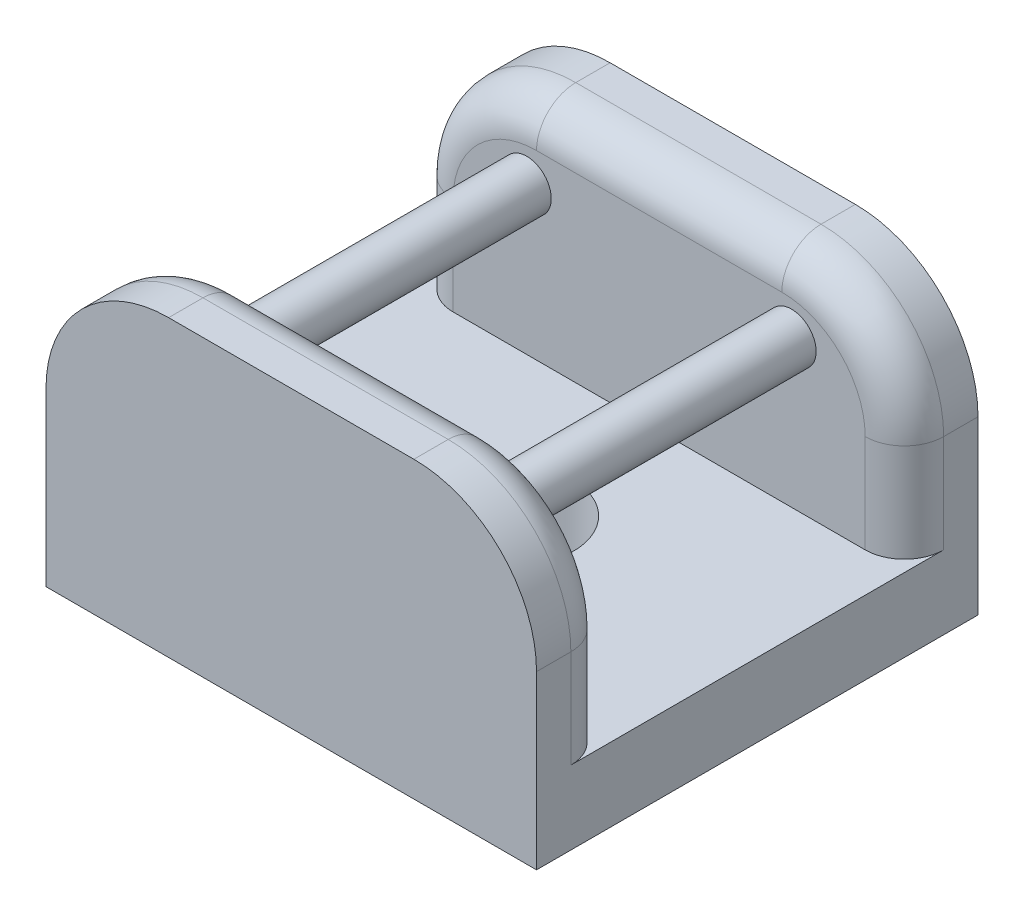
ISO-10303-21;
HEADER;
FILE_DESCRIPTION(('STEP AP214'),'2;1');
FILE_NAME('part.step','',(''),(''),'','','');
FILE_SCHEMA(('AUTOMOTIVE_DESIGN { 1 0 10303 214 1 1 1 1 }'));
ENDSEC;
DATA;
#1=APPLICATION_CONTEXT('core data for automotive mechanical design processes');
#2=APPLICATION_PROTOCOL_DEFINITION('international standard','automotive_design',2000,#1);
#3=PRODUCT_CONTEXT('',#1,'mechanical');
#4=PRODUCT('Part','Part','',(#3));
#5=PRODUCT_RELATED_PRODUCT_CATEGORY('part','',(#4));
#6=PRODUCT_DEFINITION_FORMATION('','',#4);
#7=PRODUCT_DEFINITION_CONTEXT('part definition',#1,'design');
#8=PRODUCT_DEFINITION('design','',#6,#7);
#9=PRODUCT_DEFINITION_SHAPE('','',#8);
#10=(LENGTH_UNIT() NAMED_UNIT(*) SI_UNIT(.MILLI.,.METRE.));
#11=(NAMED_UNIT(*) PLANE_ANGLE_UNIT() SI_UNIT($,.RADIAN.));
#12=(NAMED_UNIT(*) SI_UNIT($,.STERADIAN.) SOLID_ANGLE_UNIT());
#13=UNCERTAINTY_MEASURE_WITH_UNIT(LENGTH_MEASURE(1.E-05),#10,'distance_accuracy_value','');
#14=(GEOMETRIC_REPRESENTATION_CONTEXT(3) GLOBAL_UNCERTAINTY_ASSIGNED_CONTEXT((#13)) GLOBAL_UNIT_ASSIGNED_CONTEXT((#10,
#11,#12)) REPRESENTATION_CONTEXT('',''));
#15=CARTESIAN_POINT('',(0.,0.,0.));
#16=DIRECTION('',(0.,0.,1.));
#17=DIRECTION('',(1.,0.,0.));
#18=AXIS2_PLACEMENT_3D('',#15,#16,#17);
#19=CARTESIAN_POINT('',(100.,60.,-90.));
#20=DIRECTION('',(0.,0.,1.));
#21=DIRECTION('',(0.,-1.,0.));
#22=AXIS2_PLACEMENT_3D('',#19,#20,#21);
#23=PLANE('',#22);
#24=CARTESIAN_POINT('',(75.,35.,-90.));
#25=DIRECTION('',(0.,0.,-1.));
#26=DIRECTION('',(0.,1.,0.));
#27=AXIS2_PLACEMENT_3D('',#24,#25,#26);
#28=CIRCLE('',#27,25.);
#29=CARTESIAN_POINT('',(75.,60.,-90.));
#30=VERTEX_POINT('',#29);
#31=CARTESIAN_POINT('',(100.,35.,-90.));
#32=VERTEX_POINT('',#31);
#33=EDGE_CURVE('E189',#30,#32,#28,.T.);
#34=ORIENTED_EDGE('',*,*,#33,.T.);
#35=DIRECTION('',(0.,1.,0.));
#36=VECTOR('',#35,1.);
#37=CARTESIAN_POINT('',(100.,60.,-90.));
#38=LINE('',#37,#36);
#39=CARTESIAN_POINT('',(100.,0.,-90.));
#40=VERTEX_POINT('',#39);
#41=EDGE_CURVE('E320',#40,#32,#38,.T.);
#42=ORIENTED_EDGE('',*,*,#41,.F.);
#43=DIRECTION('',(-1.,0.,0.));
#44=VECTOR('',#43,1.);
#45=CARTESIAN_POINT('',(100.,0.,-90.));
#46=LINE('',#45,#44);
#47=CARTESIAN_POINT('',(0.,0.,-90.));
#48=VERTEX_POINT('',#47);
#49=EDGE_CURVE('E210',#40,#48,#46,.T.);
#50=ORIENTED_EDGE('',*,*,#49,.T.);
#51=DIRECTION('',(0.,1.,0.));
#52=VECTOR('',#51,1.);
#53=CARTESIAN_POINT('',(0.,60.,-90.));
#54=LINE('',#53,#52);
#55=CARTESIAN_POINT('',(0.,35.,-90.));
#56=VERTEX_POINT('',#55);
#57=EDGE_CURVE('E349',#48,#56,#54,.T.);
#58=ORIENTED_EDGE('',*,*,#57,.T.);
#59=CARTESIAN_POINT('',(25.,35.,-90.));
#60=DIRECTION('',(0.,0.,-1.));
#61=DIRECTION('',(0.,1.,0.));
#62=AXIS2_PLACEMENT_3D('',#59,#60,#61);
#63=CIRCLE('',#62,25.);
#64=CARTESIAN_POINT('',(25.,60.,-90.));
#65=VERTEX_POINT('',#64);
#66=EDGE_CURVE('E293',#65,#56,#63,.F.);
#67=ORIENTED_EDGE('',*,*,#66,.F.);
#68=DIRECTION('',(-1.,0.,0.));
#69=VECTOR('',#68,1.);
#70=CARTESIAN_POINT('',(100.,60.,-90.));
#71=LINE('',#70,#69);
#72=EDGE_CURVE('E207',#30,#65,#71,.T.);
#73=ORIENTED_EDGE('',*,*,#72,.F.);
#74=EDGE_LOOP('',(#34,#42,#50,#58,#67,#73));
#75=FACE_BOUND('',#74,.T.);
#76=ADVANCED_FACE('F41',(#75),#23,.F.);
#77=CARTESIAN_POINT('',(100.,15.,-75.));
#78=DIRECTION('',(0.,0.,-1.));
#79=DIRECTION('',(-1.,0.,0.));
#80=AXIS2_PLACEMENT_3D('',#77,#78,#79);
#81=PLANE('',#80);
#82=CARTESIAN_POINT('',(25.,35.,-75.));
#83=DIRECTION('',(0.,0.,-1.));
#84=DIRECTION('',(-1.,0.,0.));
#85=AXIS2_PLACEMENT_3D('',#82,#83,#84);
#86=CIRCLE('',#85,17.);
#87=CARTESIAN_POINT('',(25.,52.,-75.));
#88=VERTEX_POINT('',#87);
#89=CARTESIAN_POINT('',(7.99999999999999,35.,-75.));
#90=VERTEX_POINT('',#89);
#91=EDGE_CURVE('E265',#88,#90,#86,.F.);
#92=ORIENTED_EDGE('',*,*,#91,.T.);
#93=DIRECTION('',(0.,-1.,0.));
#94=VECTOR('',#93,1.);
#95=CARTESIAN_POINT('',(8.00000000000001,15.,-75.));
#96=LINE('',#95,#94);
#97=CARTESIAN_POINT('',(8.00000000000001,15.,-75.));
#98=VERTEX_POINT('',#97);
#99=EDGE_CURVE('E267',#90,#98,#96,.T.);
#100=ORIENTED_EDGE('',*,*,#99,.T.);
#101=DIRECTION('',(-1.,0.,0.));
#102=VECTOR('',#101,1.);
#103=CARTESIAN_POINT('',(100.,15.,-75.));
#104=LINE('',#103,#102);
#105=CARTESIAN_POINT('',(92.,15.,-75.));
#106=VERTEX_POINT('',#105);
#107=EDGE_CURVE('E199',#106,#98,#104,.T.);
#108=ORIENTED_EDGE('',*,*,#107,.F.);
#109=DIRECTION('',(0.,-1.,0.));
#110=VECTOR('',#109,1.);
#111=CARTESIAN_POINT('',(92.,15.,-75.));
#112=LINE('',#111,#110);
#113=CARTESIAN_POINT('',(92.,35.,-75.));
#114=VERTEX_POINT('',#113);
#115=EDGE_CURVE('E261',#106,#114,#112,.F.);
#116=ORIENTED_EDGE('',*,*,#115,.T.);
#117=CARTESIAN_POINT('',(75.,35.,-75.));
#118=DIRECTION('',(0.,0.,-1.));
#119=DIRECTION('',(-1.,0.,0.));
#120=AXIS2_PLACEMENT_3D('',#117,#118,#119);
#121=CIRCLE('',#120,17.);
#122=CARTESIAN_POINT('',(75.,52.,-75.));
#123=VERTEX_POINT('',#122);
#124=EDGE_CURVE('E259',#114,#123,#121,.F.);
#125=ORIENTED_EDGE('',*,*,#124,.T.);
#126=DIRECTION('',(-1.,0.,0.));
#127=VECTOR('',#126,1.);
#128=CARTESIAN_POINT('',(100.,52.,-75.));
#129=LINE('',#128,#127);
#130=EDGE_CURVE('E263',#123,#88,#129,.T.);
#131=ORIENTED_EDGE('',*,*,#130,.T.);
#132=EDGE_LOOP('',(#92,#100,#108,#116,#125,#131));
#133=FACE_BOUND('',#132,.T.);
#134=CARTESIAN_POINT('',(23.,45.,-75.));
#135=DIRECTION('',(0.,0.,-1.));
#136=DIRECTION('',(-1.,0.,0.));
#137=AXIS2_PLACEMENT_3D('',#134,#135,#136);
#138=CIRCLE('',#137,5.);
#139=CARTESIAN_POINT('',(23.,40.,-75.));
#140=VERTEX_POINT('',#139);
#141=EDGE_CURVE('E222',#140,#140,#138,.F.);
#142=ORIENTED_EDGE('',*,*,#141,.F.);
#143=EDGE_LOOP('',(#142));
#144=FACE_BOUND('',#143,.T.);
#145=CARTESIAN_POINT('',(77.,45.,-75.));
#146=DIRECTION('',(0.,0.,-1.));
#147=DIRECTION('',(-1.,0.,0.));
#148=AXIS2_PLACEMENT_3D('',#145,#146,#147);
#149=CIRCLE('',#148,5.00000000000001);
#150=CARTESIAN_POINT('',(77.,40.,-75.));
#151=VERTEX_POINT('',#150);
#152=EDGE_CURVE('E216',#151,#151,#149,.F.);
#153=ORIENTED_EDGE('',*,*,#152,.F.);
#154=EDGE_LOOP('',(#153));
#155=FACE_BOUND('',#154,.T.);
#156=ADVANCED_FACE('F371',(#133,#144,#155),#81,.F.);
#157=CARTESIAN_POINT('',(100.,60.,-15.));
#158=DIRECTION('',(0.,0.,1.));
#159=DIRECTION('',(0.,-1.,0.));
#160=AXIS2_PLACEMENT_3D('',#157,#158,#159);
#161=PLANE('',#160);
#162=CARTESIAN_POINT('',(75.,35.0000000000001,-15.));
#163=DIRECTION('',(0.,0.,1.));
#164=DIRECTION('',(0.,-1.,0.));
#165=AXIS2_PLACEMENT_3D('',#162,#163,#164);
#166=CIRCLE('',#165,17.);
#167=CARTESIAN_POINT('',(75.,52.0000000000001,-15.));
#168=VERTEX_POINT('',#167);
#169=CARTESIAN_POINT('',(92.,35.0000000000001,-15.));
#170=VERTEX_POINT('',#169);
#171=EDGE_CURVE('E240',#168,#170,#166,.F.);
#172=ORIENTED_EDGE('',*,*,#171,.T.);
#173=DIRECTION('',(0.,1.,0.));
#174=VECTOR('',#173,1.);
#175=CARTESIAN_POINT('',(92.,60.,-15.));
#176=LINE('',#175,#174);
#177=CARTESIAN_POINT('',(92.,15.,-15.));
#178=VERTEX_POINT('',#177);
#179=EDGE_CURVE('E248',#170,#178,#176,.F.);
#180=ORIENTED_EDGE('',*,*,#179,.T.);
#181=DIRECTION('',(-1.,0.,0.));
#182=VECTOR('',#181,1.);
#183=CARTESIAN_POINT('',(100.,15.,-15.));
#184=LINE('',#183,#182);
#185=CARTESIAN_POINT('',(8.00000000000001,15.,-15.));
#186=VERTEX_POINT('',#185);
#187=EDGE_CURVE('E195',#178,#186,#184,.T.);
#188=ORIENTED_EDGE('',*,*,#187,.T.);
#189=DIRECTION('',(0.,1.,0.));
#190=VECTOR('',#189,1.);
#191=CARTESIAN_POINT('',(8.00000000000001,35.,-15.));
#192=LINE('',#191,#190);
#193=CARTESIAN_POINT('',(7.99999999999999,35.0000000000001,-15.));
#194=VERTEX_POINT('',#193);
#195=EDGE_CURVE('E246',#186,#194,#192,.T.);
#196=ORIENTED_EDGE('',*,*,#195,.T.);
#197=CARTESIAN_POINT('',(25.,35.0000000000001,-15.));
#198=DIRECTION('',(0.,0.,1.));
#199=DIRECTION('',(0.,-1.,0.));
#200=AXIS2_PLACEMENT_3D('',#197,#198,#199);
#201=CIRCLE('',#200,17.);
#202=CARTESIAN_POINT('',(25.,52.,-15.));
#203=VERTEX_POINT('',#202);
#204=EDGE_CURVE('E244',#194,#203,#201,.F.);
#205=ORIENTED_EDGE('',*,*,#204,.T.);
#206=DIRECTION('',(-1.,0.,0.));
#207=VECTOR('',#206,1.);
#208=CARTESIAN_POINT('',(100.,52.,-15.));
#209=LINE('',#208,#207);
#210=EDGE_CURVE('E242',#203,#168,#209,.F.);
#211=ORIENTED_EDGE('',*,*,#210,.T.);
#212=EDGE_LOOP('',(#172,#180,#188,#196,#205,#211));
#213=FACE_BOUND('',#212,.T.);
#214=CARTESIAN_POINT('',(23.,45.,-15.));
#215=DIRECTION('',(0.,0.,1.));
#216=DIRECTION('',(0.,-1.,0.));
#217=AXIS2_PLACEMENT_3D('',#214,#215,#216);
#218=CIRCLE('',#217,5.);
#219=CARTESIAN_POINT('',(23.,40.,-15.));
#220=VERTEX_POINT('',#219);
#221=EDGE_CURVE('E219',#220,#220,#218,.F.);
#222=ORIENTED_EDGE('',*,*,#221,.F.);
#223=EDGE_LOOP('',(#222));
#224=FACE_BOUND('',#223,.T.);
#225=CARTESIAN_POINT('',(77.,45.,-15.));
#226=DIRECTION('',(0.,0.,1.));
#227=DIRECTION('',(0.,-1.,0.));
#228=AXIS2_PLACEMENT_3D('',#225,#226,#227);
#229=CIRCLE('',#228,5.00000000000001);
#230=CARTESIAN_POINT('',(77.,40.,-15.));
#231=VERTEX_POINT('',#230);
#232=EDGE_CURVE('E213',#231,#231,#229,.F.);
#233=ORIENTED_EDGE('',*,*,#232,.F.);
#234=EDGE_LOOP('',(#233));
#235=FACE_BOUND('',#234,.T.);
#236=ADVANCED_FACE('F405',(#213,#224,#235),#161,.F.);
#237=CARTESIAN_POINT('',(100.,0.,0.));
#238=DIRECTION('',(0.,0.,-1.));
#239=DIRECTION('',(-1.,0.,0.));
#240=AXIS2_PLACEMENT_3D('',#237,#238,#239);
#241=PLANE('',#240);
#242=CARTESIAN_POINT('',(75.,35.0000000000001,0.));
#243=DIRECTION('',(0.,0.,-1.));
#244=DIRECTION('',(0.,1.,0.));
#245=AXIS2_PLACEMENT_3D('',#242,#243,#244);
#246=CIRCLE('',#245,25.);
#247=CARTESIAN_POINT('',(75.,60.,0.));
#248=VERTEX_POINT('',#247);
#249=CARTESIAN_POINT('',(100.,35.0000000000001,0.));
#250=VERTEX_POINT('',#249);
#251=EDGE_CURVE('E171',#248,#250,#246,.T.);
#252=ORIENTED_EDGE('',*,*,#251,.F.);
#253=DIRECTION('',(-1.,0.,0.));
#254=VECTOR('',#253,1.);
#255=CARTESIAN_POINT('',(100.,60.,0.));
#256=LINE('',#255,#254);
#257=CARTESIAN_POINT('',(25.,60.,0.));
#258=VERTEX_POINT('',#257);
#259=EDGE_CURVE('E186',#248,#258,#256,.T.);
#260=ORIENTED_EDGE('',*,*,#259,.T.);
#261=CARTESIAN_POINT('',(25.,35.0000000000001,0.));
#262=DIRECTION('',(0.,0.,-1.));
#263=DIRECTION('',(0.,1.,0.));
#264=AXIS2_PLACEMENT_3D('',#261,#262,#263);
#265=CIRCLE('',#264,25.);
#266=CARTESIAN_POINT('',(0.,35.0000000000001,0.));
#267=VERTEX_POINT('',#266);
#268=EDGE_CURVE('E334',#258,#267,#265,.F.);
#269=ORIENTED_EDGE('',*,*,#268,.T.);
#270=DIRECTION('',(0.,-1.,0.));
#271=VECTOR('',#270,1.);
#272=CARTESIAN_POINT('',(0.,0.,0.));
#273=LINE('',#272,#271);
#274=CARTESIAN_POINT('',(0.,0.,0.));
#275=VERTEX_POINT('',#274);
#276=EDGE_CURVE('E343',#267,#275,#273,.T.);
#277=ORIENTED_EDGE('',*,*,#276,.T.);
#278=DIRECTION('',(-1.,0.,0.));
#279=VECTOR('',#278,1.);
#280=CARTESIAN_POINT('',(100.,0.,0.));
#281=LINE('',#280,#279);
#282=CARTESIAN_POINT('',(100.,0.,0.));
#283=VERTEX_POINT('',#282);
#284=EDGE_CURVE('E196',#283,#275,#281,.T.);
#285=ORIENTED_EDGE('',*,*,#284,.F.);
#286=DIRECTION('',(0.,-1.,0.));
#287=VECTOR('',#286,1.);
#288=CARTESIAN_POINT('',(100.,0.,0.));
#289=LINE('',#288,#287);
#290=EDGE_CURVE('E188',#250,#283,#289,.T.);
#291=ORIENTED_EDGE('',*,*,#290,.F.);
#292=EDGE_LOOP('',(#252,#260,#269,#277,#285,#291));
#293=FACE_BOUND('',#292,.T.);
#294=ADVANCED_FACE('F184',(#293),#241,.F.);
#295=CARTESIAN_POINT('',(100.,0.,0.));
#296=DIRECTION('',(-1.,0.,0.));
#297=DIRECTION('',(0.,0.,1.));
#298=AXIS2_PLACEMENT_3D('',#295,#296,#297);
#299=PLANE('',#298);
#300=DIRECTION('',(0.,0.,1.));
#301=VECTOR('',#300,1.);
#302=CARTESIAN_POINT('',(100.,15.,-15.));
#303=LINE('',#302,#301);
#304=CARTESIAN_POINT('',(100.,15.,-83.));
#305=VERTEX_POINT('',#304);
#306=CARTESIAN_POINT('',(100.,15.,-7.));
#307=VERTEX_POINT('',#306);
#308=EDGE_CURVE('E317',#305,#307,#303,.T.);
#309=ORIENTED_EDGE('',*,*,#308,.T.);
#310=DIRECTION('',(0.,1.,0.));
#311=VECTOR('',#310,1.);
#312=CARTESIAN_POINT('',(100.,0.,-7.));
#313=LINE('',#312,#311);
#314=CARTESIAN_POINT('',(100.,35.0000000000001,-7.));
#315=VERTEX_POINT('',#314);
#316=EDGE_CURVE('E237',#307,#315,#313,.T.);
#317=ORIENTED_EDGE('',*,*,#316,.T.);
#318=DIRECTION('',(0.,0.,-1.));
#319=VECTOR('',#318,1.);
#320=CARTESIAN_POINT('',(100.,35.0000000000001,0.));
#321=LINE('',#320,#319);
#322=EDGE_CURVE('E178',#250,#315,#321,.T.);
#323=ORIENTED_EDGE('',*,*,#322,.F.);
#324=ORIENTED_EDGE('',*,*,#290,.T.);
#325=DIRECTION('',(0.,0.,-1.));
#326=VECTOR('',#325,1.);
#327=CARTESIAN_POINT('',(100.,0.,-90.));
#328=LINE('',#327,#326);
#329=EDGE_CURVE('E341',#283,#40,#328,.T.);
#330=ORIENTED_EDGE('',*,*,#329,.T.);
#331=ORIENTED_EDGE('',*,*,#41,.T.);
#332=DIRECTION('',(0.,0.,-1.));
#333=VECTOR('',#332,1.);
#334=CARTESIAN_POINT('',(100.,35.0000000000001,0.));
#335=LINE('',#334,#333);
#336=CARTESIAN_POINT('',(100.,35.,-82.9999999999999));
#337=VERTEX_POINT('',#336);
#338=EDGE_CURVE('E232',#337,#32,#335,.T.);
#339=ORIENTED_EDGE('',*,*,#338,.F.);
#340=DIRECTION('',(0.,-1.,0.));
#341=VECTOR('',#340,1.);
#342=CARTESIAN_POINT('',(100.,0.,-83.));
#343=LINE('',#342,#341);
#344=EDGE_CURVE('E234',#337,#305,#343,.T.);
#345=ORIENTED_EDGE('',*,*,#344,.T.);
#346=EDGE_LOOP('',(#309,#317,#323,#324,#330,#331,#339,#345));
#347=FACE_BOUND('',#346,.T.);
#348=ADVANCED_FACE('F316',(#347),#299,.F.);
#349=CARTESIAN_POINT('',(100.,0.,-90.));
#350=DIRECTION('',(0.,1.,0.));
#351=DIRECTION('',(0.,0.,1.));
#352=AXIS2_PLACEMENT_3D('',#349,#350,#351);
#353=PLANE('',#352);
#354=CARTESIAN_POINT('',(50.,0.,-45.));
#355=DIRECTION('',(0.,-1.,0.));
#356=DIRECTION('',(0.,0.,-1.));
#357=AXIS2_PLACEMENT_3D('',#354,#355,#356);
#358=CIRCLE('',#357,12.5);
#359=CARTESIAN_POINT('',(50.,0.,-57.5));
#360=VERTEX_POINT('',#359);
#361=EDGE_CURVE('E230',#360,#360,#358,.T.);
#362=ORIENTED_EDGE('',*,*,#361,.F.);
#363=EDGE_LOOP('',(#362));
#364=FACE_BOUND('',#363,.T.);
#365=DIRECTION('',(0.,0.,-1.));
#366=VECTOR('',#365,1.);
#367=CARTESIAN_POINT('',(0.,0.,-90.));
#368=LINE('',#367,#366);
#369=EDGE_CURVE('E229',#275,#48,#368,.T.);
#370=ORIENTED_EDGE('',*,*,#369,.T.);
#371=ORIENTED_EDGE('',*,*,#49,.F.);
#372=ORIENTED_EDGE('',*,*,#329,.F.);
#373=ORIENTED_EDGE('',*,*,#284,.T.);
#374=EDGE_LOOP('',(#370,#371,#372,#373));
#375=FACE_BOUND('',#374,.T.);
#376=ADVANCED_FACE('F358',(#364,#375),#353,.F.);
#377=CARTESIAN_POINT('',(100.,60.,-75.));
#378=DIRECTION('',(0.,-1.,0.));
#379=DIRECTION('',(0.,0.,-1.));
#380=AXIS2_PLACEMENT_3D('',#377,#378,#379);
#381=PLANE('',#380);
#382=DIRECTION('',(0.,0.,-1.));
#383=VECTOR('',#382,1.);
#384=CARTESIAN_POINT('',(25.,60.,0.));
#385=LINE('',#384,#383);
#386=CARTESIAN_POINT('',(25.,60.,-82.9999999999999));
#387=VERTEX_POINT('',#386);
#388=EDGE_CURVE('E336',#387,#65,#385,.T.);
#389=ORIENTED_EDGE('',*,*,#388,.F.);
#390=DIRECTION('',(-1.,0.,0.));
#391=VECTOR('',#390,1.);
#392=CARTESIAN_POINT('',(100.,60.,-83.));
#393=LINE('',#392,#391);
#394=CARTESIAN_POINT('',(75.,60.,-82.9999999999999));
#395=VERTEX_POINT('',#394);
#396=EDGE_CURVE('E58',#387,#395,#393,.F.);
#397=ORIENTED_EDGE('',*,*,#396,.T.);
#398=DIRECTION('',(0.,0.,-1.));
#399=VECTOR('',#398,1.);
#400=CARTESIAN_POINT('',(75.,60.,0.));
#401=LINE('',#400,#399);
#402=EDGE_CURVE('E179',#395,#30,#401,.T.);
#403=ORIENTED_EDGE('',*,*,#402,.T.);
#404=ORIENTED_EDGE('',*,*,#72,.T.);
#405=EDGE_LOOP('',(#389,#397,#403,#404));
#406=FACE_BOUND('',#405,.T.);
#407=ADVANCED_FACE('F362',(#406),#381,.F.);
#408=CARTESIAN_POINT('',(100.,15.,-15.));
#409=DIRECTION('',(0.,-1.,0.));
#410=DIRECTION('',(0.,0.,-1.));
#411=AXIS2_PLACEMENT_3D('',#408,#409,#410);
#412=PLANE('',#411);
#413=CARTESIAN_POINT('',(50.,15.,-45.));
#414=DIRECTION('',(0.,-1.,0.));
#415=DIRECTION('',(0.,0.,-1.));
#416=AXIS2_PLACEMENT_3D('',#413,#414,#415);
#417=CIRCLE('',#416,12.5);
#418=CARTESIAN_POINT('',(50.,15.,-57.5));
#419=VERTEX_POINT('',#418);
#420=EDGE_CURVE('E226',#419,#419,#417,.T.);
#421=ORIENTED_EDGE('',*,*,#420,.T.);
#422=EDGE_LOOP('',(#421));
#423=FACE_BOUND('',#422,.T.);
#424=DIRECTION('',(0.,0.,1.));
#425=VECTOR('',#424,1.);
#426=CARTESIAN_POINT('',(0.,15.,-15.));
#427=LINE('',#426,#425);
#428=CARTESIAN_POINT('',(0.,15.,-83.));
#429=VERTEX_POINT('',#428);
#430=CARTESIAN_POINT('',(0.,15.,-7.));
#431=VERTEX_POINT('',#430);
#432=EDGE_CURVE('E352',#429,#431,#427,.T.);
#433=ORIENTED_EDGE('',*,*,#432,.T.);
#434=CARTESIAN_POINT('',(8.00000000000001,15.,-7.));
#435=DIRECTION('',(0.,-1.,0.));
#436=DIRECTION('',(0.,0.,-1.));
#437=AXIS2_PLACEMENT_3D('',#434,#435,#436);
#438=CIRCLE('',#437,8.);
#439=EDGE_CURVE('E278',#431,#186,#438,.T.);
#440=ORIENTED_EDGE('',*,*,#439,.T.);
#441=ORIENTED_EDGE('',*,*,#187,.F.);
#442=CARTESIAN_POINT('',(92.,15.,-7.));
#443=DIRECTION('',(0.,-1.,0.));
#444=DIRECTION('',(0.,0.,-1.));
#445=AXIS2_PLACEMENT_3D('',#442,#443,#444);
#446=CIRCLE('',#445,8.);
#447=EDGE_CURVE('E275',#178,#307,#446,.T.);
#448=ORIENTED_EDGE('',*,*,#447,.T.);
#449=ORIENTED_EDGE('',*,*,#308,.F.);
#450=CARTESIAN_POINT('',(92.,15.,-83.));
#451=DIRECTION('',(0.,-1.,0.));
#452=DIRECTION('',(0.,0.,-1.));
#453=AXIS2_PLACEMENT_3D('',#450,#451,#452);
#454=CIRCLE('',#453,8.);
#455=EDGE_CURVE('E11',#305,#106,#454,.T.);
#456=ORIENTED_EDGE('',*,*,#455,.T.);
#457=ORIENTED_EDGE('',*,*,#107,.T.);
#458=CARTESIAN_POINT('',(8.00000000000001,15.,-83.));
#459=DIRECTION('',(0.,-1.,0.));
#460=DIRECTION('',(0.,0.,-1.));
#461=AXIS2_PLACEMENT_3D('',#458,#459,#460);
#462=CIRCLE('',#461,8.);
#463=EDGE_CURVE('E50',#98,#429,#462,.T.);
#464=ORIENTED_EDGE('',*,*,#463,.T.);
#465=EDGE_LOOP('',(#433,#440,#441,#448,#449,#456,#457,#464));
#466=FACE_BOUND('',#465,.T.);
#467=ADVANCED_FACE('F375',(#423,#466),#412,.F.);
#468=CARTESIAN_POINT('',(100.,60.,0.));
#469=DIRECTION('',(0.,-1.,0.));
#470=DIRECTION('',(0.,0.,-1.));
#471=AXIS2_PLACEMENT_3D('',#468,#469,#470);
#472=PLANE('',#471);
#473=CARTESIAN_POINT('',(75.,60.,-7.));
#474=VERTEX_POINT('',#473);
#475=EDGE_CURVE('E167',#248,#474,#401,.T.);
#476=ORIENTED_EDGE('',*,*,#475,.T.);
#477=DIRECTION('',(-1.,0.,0.));
#478=VECTOR('',#477,1.);
#479=CARTESIAN_POINT('',(100.,60.,-6.99999999999999));
#480=LINE('',#479,#478);
#481=CARTESIAN_POINT('',(25.,60.,-6.99999999999999));
#482=VERTEX_POINT('',#481);
#483=EDGE_CURVE('E257',#474,#482,#480,.T.);
#484=ORIENTED_EDGE('',*,*,#483,.T.);
#485=EDGE_CURVE('E194',#258,#482,#385,.T.);
#486=ORIENTED_EDGE('',*,*,#485,.F.);
#487=ORIENTED_EDGE('',*,*,#259,.F.);
#488=EDGE_LOOP('',(#476,#484,#486,#487));
#489=FACE_BOUND('',#488,.T.);
#490=ADVANCED_FACE('F192',(#489),#472,.F.);
#491=CARTESIAN_POINT('',(0.,0.,0.));
#492=DIRECTION('',(-1.,0.,0.));
#493=DIRECTION('',(0.,0.,1.));
#494=AXIS2_PLACEMENT_3D('',#491,#492,#493);
#495=PLANE('',#494);
#496=DIRECTION('',(0.,0.,-1.));
#497=VECTOR('',#496,1.);
#498=CARTESIAN_POINT('',(0.,35.0000000000001,0.));
#499=LINE('',#498,#497);
#500=CARTESIAN_POINT('',(0.,35.0000000000001,-7.));
#501=VERTEX_POINT('',#500);
#502=EDGE_CURVE('E328',#267,#501,#499,.T.);
#503=ORIENTED_EDGE('',*,*,#502,.T.);
#504=DIRECTION('',(0.,1.,0.));
#505=VECTOR('',#504,1.);
#506=CARTESIAN_POINT('',(0.,15.,-7.));
#507=LINE('',#506,#505);
#508=EDGE_CURVE('E252',#501,#431,#507,.F.);
#509=ORIENTED_EDGE('',*,*,#508,.T.);
#510=ORIENTED_EDGE('',*,*,#432,.F.);
#511=DIRECTION('',(0.,-1.,0.));
#512=VECTOR('',#511,1.);
#513=CARTESIAN_POINT('',(0.,35.,-83.));
#514=LINE('',#513,#512);
#515=CARTESIAN_POINT('',(0.,35.,-82.9999999999999));
#516=VERTEX_POINT('',#515);
#517=EDGE_CURVE('E250',#429,#516,#514,.F.);
#518=ORIENTED_EDGE('',*,*,#517,.T.);
#519=DIRECTION('',(0.,0.,-1.));
#520=VECTOR('',#519,1.);
#521=CARTESIAN_POINT('',(0.,35.0000000000001,0.));
#522=LINE('',#521,#520);
#523=EDGE_CURVE('E225',#56,#516,#522,.F.);
#524=ORIENTED_EDGE('',*,*,#523,.F.);
#525=ORIENTED_EDGE('',*,*,#57,.F.);
#526=ORIENTED_EDGE('',*,*,#369,.F.);
#527=ORIENTED_EDGE('',*,*,#276,.F.);
#528=EDGE_LOOP('',(#503,#509,#510,#518,#524,#525,#526,#527));
#529=FACE_BOUND('',#528,.T.);
#530=ADVANCED_FACE('F360',(#529),#495,.T.);
#531=CARTESIAN_POINT('',(77.,45.,-89.1421356237309));
#532=DIRECTION('',(0.,0.,1.));
#533=DIRECTION('',(0.,-1.,0.));
#534=AXIS2_PLACEMENT_3D('',#531,#532,#533);
#535=CYLINDRICAL_SURFACE('',#534,5.00000000000001);
#536=CARTESIAN_POINT('',(77.,40.,-15.));
#537=CARTESIAN_POINT('',(77.,40.,-15.625));
#538=CARTESIAN_POINT('',(77.,40.,-16.25));
#539=CARTESIAN_POINT('',(77.,40.,-17.5));
#540=CARTESIAN_POINT('',(77.,40.,-18.125));
#541=CARTESIAN_POINT('',(77.,40.,-19.375));
#542=CARTESIAN_POINT('',(77.,40.,-20.));
#543=CARTESIAN_POINT('',(77.,40.,-21.25));
#544=CARTESIAN_POINT('',(77.,40.,-21.875));
#545=CARTESIAN_POINT('',(77.,40.,-23.125));
#546=CARTESIAN_POINT('',(77.,40.,-23.75));
#547=CARTESIAN_POINT('',(77.,40.,-25.));
#548=CARTESIAN_POINT('',(77.,40.,-25.625));
#549=CARTESIAN_POINT('',(77.,40.,-26.875));
#550=CARTESIAN_POINT('',(77.,40.,-27.5));
#551=CARTESIAN_POINT('',(77.,40.,-28.75));
#552=CARTESIAN_POINT('',(77.,40.,-29.375));
#553=CARTESIAN_POINT('',(77.,40.,-30.625));
#554=CARTESIAN_POINT('',(77.,40.,-31.25));
#555=CARTESIAN_POINT('',(77.,40.,-32.5));
#556=CARTESIAN_POINT('',(77.,40.,-33.125));
#557=CARTESIAN_POINT('',(77.,40.,-34.375));
#558=CARTESIAN_POINT('',(77.,40.,-35.));
#559=CARTESIAN_POINT('',(77.,40.,-36.25));
#560=CARTESIAN_POINT('',(77.,40.,-36.875));
#561=CARTESIAN_POINT('',(77.,40.,-38.125));
#562=CARTESIAN_POINT('',(77.,40.,-38.75));
#563=CARTESIAN_POINT('',(77.,40.,-40.));
#564=CARTESIAN_POINT('',(77.,40.,-40.625));
#565=CARTESIAN_POINT('',(77.,40.,-41.875));
#566=CARTESIAN_POINT('',(77.,40.,-42.5));
#567=CARTESIAN_POINT('',(77.,40.,-43.75));
#568=CARTESIAN_POINT('',(77.,40.,-44.375));
#569=CARTESIAN_POINT('',(77.,40.,-45.625));
#570=CARTESIAN_POINT('',(77.,40.,-46.25));
#571=CARTESIAN_POINT('',(77.,40.,-47.5));
#572=CARTESIAN_POINT('',(77.,40.,-48.125));
#573=CARTESIAN_POINT('',(77.,40.,-49.375));
#574=CARTESIAN_POINT('',(77.,40.,-50.));
#575=CARTESIAN_POINT('',(77.,40.,-51.25));
#576=CARTESIAN_POINT('',(77.,40.,-51.875));
#577=CARTESIAN_POINT('',(77.,40.,-53.125));
#578=CARTESIAN_POINT('',(77.,40.,-53.75));
#579=CARTESIAN_POINT('',(77.,40.,-55.));
#580=CARTESIAN_POINT('',(77.,40.,-55.625));
#581=CARTESIAN_POINT('',(77.,40.,-56.875));
#582=CARTESIAN_POINT('',(77.,40.,-57.5));
#583=CARTESIAN_POINT('',(77.,40.,-58.75));
#584=CARTESIAN_POINT('',(77.,40.,-59.375));
#585=CARTESIAN_POINT('',(77.,40.,-60.625));
#586=CARTESIAN_POINT('',(77.,40.,-61.25));
#587=CARTESIAN_POINT('',(77.,40.,-62.5));
#588=CARTESIAN_POINT('',(77.,40.,-63.125));
#589=CARTESIAN_POINT('',(77.,40.,-64.375));
#590=CARTESIAN_POINT('',(77.,40.,-65.));
#591=CARTESIAN_POINT('',(77.,40.,-66.25));
#592=CARTESIAN_POINT('',(77.,40.,-66.875));
#593=CARTESIAN_POINT('',(77.,40.,-68.125));
#594=CARTESIAN_POINT('',(77.,40.,-68.75));
#595=CARTESIAN_POINT('',(77.,40.,-70.));
#596=CARTESIAN_POINT('',(77.,40.,-70.625));
#597=CARTESIAN_POINT('',(77.,40.,-71.875));
#598=CARTESIAN_POINT('',(77.,40.,-72.5));
#599=CARTESIAN_POINT('',(77.,40.,-73.75));
#600=CARTESIAN_POINT('',(77.,40.,-74.375));
#601=CARTESIAN_POINT('',(77.,40.,-75.));
#602=B_SPLINE_CURVE_WITH_KNOTS('',3,(#536,#537,#538,#539,#540,#541,#542,#543,#544,#545,#546,
#547,#548,#549,#550,#551,#552,#553,#554,#555,#556,#557,#558,#559,#560,#561,#562,#563,#564,#565,
#566,#567,#568,#569,#570,#571,#572,#573,#574,#575,#576,#577,#578,#579,#580,#581,#582,#583,#584,
#585,#586,#587,#588,#589,#590,#591,#592,#593,#594,#595,#596,#597,#598,#599,#600,#601),
.UNSPECIFIED.,.F.,.F.,(4,2,2,2,2,2,2,2,2,2,2,2,2,2,2,2,2,2,2,2,2,2,2,2,2,2,2,2,2,2,2,2,4),(0.,
1.875,3.75,5.62499999999999,7.49999999999999,9.37499999999999,11.25,13.125,15.,16.875,18.75,
20.625,22.5,24.375,26.25,28.125,30.,31.875,33.75,35.625,37.5,39.375,41.25,43.125,45.,46.875,
48.75,50.625,52.5,54.375,56.25,58.125,60.),.UNSPECIFIED.);
#603=EDGE_CURVE('BSEAM413',#231,#151,#602,.T.);
#604=ORIENTED_EDGE('',*,*,#232,.T.);
#605=ORIENTED_EDGE('',*,*,#152,.T.);
#606=ORIENTED_EDGE('',*,*,#603,.T.);
#607=ORIENTED_EDGE('',*,*,#603,.F.);
#608=EDGE_LOOP('',(#604,#606,#605,#607));
#609=FACE_BOUND('',#608,.T.);
#610=ADVANCED_FACE('F413',(#609),#535,.T.);
#611=CARTESIAN_POINT('',(23.,45.,-89.1421356237309));
#612=DIRECTION('',(0.,0.,1.));
#613=DIRECTION('',(0.,-1.,0.));
#614=AXIS2_PLACEMENT_3D('',#611,#612,#613);
#615=CYLINDRICAL_SURFACE('',#614,5.);
#616=CARTESIAN_POINT('',(23.,40.,-15.));
#617=CARTESIAN_POINT('',(23.,40.,-15.625));
#618=CARTESIAN_POINT('',(23.,40.,-16.25));
#619=CARTESIAN_POINT('',(23.,40.,-17.5));
#620=CARTESIAN_POINT('',(23.,40.,-18.125));
#621=CARTESIAN_POINT('',(23.,40.,-19.375));
#622=CARTESIAN_POINT('',(23.,40.,-20.));
#623=CARTESIAN_POINT('',(23.,40.,-21.25));
#624=CARTESIAN_POINT('',(23.,40.,-21.875));
#625=CARTESIAN_POINT('',(23.,40.,-23.125));
#626=CARTESIAN_POINT('',(23.,40.,-23.75));
#627=CARTESIAN_POINT('',(23.,40.,-25.));
#628=CARTESIAN_POINT('',(23.,40.,-25.625));
#629=CARTESIAN_POINT('',(23.,40.,-26.875));
#630=CARTESIAN_POINT('',(23.,40.,-27.5));
#631=CARTESIAN_POINT('',(23.,40.,-28.75));
#632=CARTESIAN_POINT('',(23.,40.,-29.375));
#633=CARTESIAN_POINT('',(23.,40.,-30.625));
#634=CARTESIAN_POINT('',(23.,40.,-31.25));
#635=CARTESIAN_POINT('',(23.,40.,-32.5));
#636=CARTESIAN_POINT('',(23.,40.,-33.125));
#637=CARTESIAN_POINT('',(23.,40.,-34.375));
#638=CARTESIAN_POINT('',(23.,40.,-35.));
#639=CARTESIAN_POINT('',(23.,40.,-36.25));
#640=CARTESIAN_POINT('',(23.,40.,-36.875));
#641=CARTESIAN_POINT('',(23.,40.,-38.125));
#642=CARTESIAN_POINT('',(23.,40.,-38.75));
#643=CARTESIAN_POINT('',(23.,40.,-40.));
#644=CARTESIAN_POINT('',(23.,40.,-40.625));
#645=CARTESIAN_POINT('',(23.,40.,-41.875));
#646=CARTESIAN_POINT('',(23.,40.,-42.5));
#647=CARTESIAN_POINT('',(23.,40.,-43.75));
#648=CARTESIAN_POINT('',(23.,40.,-44.375));
#649=CARTESIAN_POINT('',(23.,40.,-45.625));
#650=CARTESIAN_POINT('',(23.,40.,-46.25));
#651=CARTESIAN_POINT('',(23.,40.,-47.5));
#652=CARTESIAN_POINT('',(23.,40.,-48.125));
#653=CARTESIAN_POINT('',(23.,40.,-49.375));
#654=CARTESIAN_POINT('',(23.,40.,-50.));
#655=CARTESIAN_POINT('',(23.,40.,-51.25));
#656=CARTESIAN_POINT('',(23.,40.,-51.875));
#657=CARTESIAN_POINT('',(23.,40.,-53.125));
#658=CARTESIAN_POINT('',(23.,40.,-53.75));
#659=CARTESIAN_POINT('',(23.,40.,-55.));
#660=CARTESIAN_POINT('',(23.,40.,-55.625));
#661=CARTESIAN_POINT('',(23.,40.,-56.875));
#662=CARTESIAN_POINT('',(23.,40.,-57.5));
#663=CARTESIAN_POINT('',(23.,40.,-58.75));
#664=CARTESIAN_POINT('',(23.,40.,-59.375));
#665=CARTESIAN_POINT('',(23.,40.,-60.625));
#666=CARTESIAN_POINT('',(23.,40.,-61.25));
#667=CARTESIAN_POINT('',(23.,40.,-62.5));
#668=CARTESIAN_POINT('',(23.,40.,-63.125));
#669=CARTESIAN_POINT('',(23.,40.,-64.375));
#670=CARTESIAN_POINT('',(23.,40.,-65.));
#671=CARTESIAN_POINT('',(23.,40.,-66.25));
#672=CARTESIAN_POINT('',(23.,40.,-66.875));
#673=CARTESIAN_POINT('',(23.,40.,-68.125));
#674=CARTESIAN_POINT('',(23.,40.,-68.75));
#675=CARTESIAN_POINT('',(23.,40.,-70.));
#676=CARTESIAN_POINT('',(23.,40.,-70.625));
#677=CARTESIAN_POINT('',(23.,40.,-71.875));
#678=CARTESIAN_POINT('',(23.,40.,-72.5));
#679=CARTESIAN_POINT('',(23.,40.,-73.75));
#680=CARTESIAN_POINT('',(23.,40.,-74.375));
#681=CARTESIAN_POINT('',(23.,40.,-75.));
#682=B_SPLINE_CURVE_WITH_KNOTS('',3,(#616,#617,#618,#619,#620,#621,#622,#623,#624,#625,#626,
#627,#628,#629,#630,#631,#632,#633,#634,#635,#636,#637,#638,#639,#640,#641,#642,#643,#644,#645,
#646,#647,#648,#649,#650,#651,#652,#653,#654,#655,#656,#657,#658,#659,#660,#661,#662,#663,#664,
#665,#666,#667,#668,#669,#670,#671,#672,#673,#674,#675,#676,#677,#678,#679,#680,#681),
.UNSPECIFIED.,.F.,.F.,(4,2,2,2,2,2,2,2,2,2,2,2,2,2,2,2,2,2,2,2,2,2,2,2,2,2,2,2,2,2,2,2,4),(0.,
1.875,3.75,5.62499999999999,7.49999999999999,9.37499999999999,11.25,13.125,15.,16.875,18.75,
20.625,22.5,24.375,26.25,28.125,30.,31.875,33.75,35.625,37.5,39.375,41.25,43.125,45.,46.875,
48.75,50.625,52.5,54.375,56.25,58.125,60.),.UNSPECIFIED.);
#683=EDGE_CURVE('BSEAM416',#220,#140,#682,.T.);
#684=ORIENTED_EDGE('',*,*,#221,.T.);
#685=ORIENTED_EDGE('',*,*,#141,.T.);
#686=ORIENTED_EDGE('',*,*,#683,.T.);
#687=ORIENTED_EDGE('',*,*,#683,.F.);
#688=EDGE_LOOP('',(#684,#686,#685,#687));
#689=FACE_BOUND('',#688,.T.);
#690=ADVANCED_FACE('F416',(#689),#615,.T.);
#691=CARTESIAN_POINT('',(50.,60.,-45.));
#692=DIRECTION('',(0.,-1.,0.));
#693=DIRECTION('',(0.,0.,-1.));
#694=AXIS2_PLACEMENT_3D('',#691,#692,#693);
#695=CYLINDRICAL_SURFACE('',#694,12.5);
#696=ORIENTED_EDGE('',*,*,#361,.T.);
#697=EDGE_LOOP('',(#696));
#698=FACE_BOUND('',#697,.T.);
#699=ORIENTED_EDGE('',*,*,#420,.F.);
#700=EDGE_LOOP('',(#699));
#701=FACE_BOUND('',#700,.T.);
#702=ADVANCED_FACE('F500',(#698,#701),#695,.F.);
#703=CARTESIAN_POINT('',(25.,35.0000000000001,0.));
#704=DIRECTION('',(0.,0.,-1.));
#705=DIRECTION('',(0.,1.,0.));
#706=AXIS2_PLACEMENT_3D('',#703,#704,#705);
#707=CYLINDRICAL_SURFACE('',#706,25.);
#708=ORIENTED_EDGE('',*,*,#485,.T.);
#709=CARTESIAN_POINT('',(25.,35.0000000000001,-7.));
#710=DIRECTION('',(0.,0.,1.));
#711=DIRECTION('',(0.,-1.,0.));
#712=AXIS2_PLACEMENT_3D('',#709,#710,#711);
#713=CIRCLE('',#712,25.);
#714=EDGE_CURVE('E255',#482,#501,#713,.T.);
#715=ORIENTED_EDGE('',*,*,#714,.T.);
#716=ORIENTED_EDGE('',*,*,#502,.F.);
#717=ORIENTED_EDGE('',*,*,#268,.F.);
#718=EDGE_LOOP('',(#708,#715,#716,#717));
#719=FACE_BOUND('',#718,.T.);
#720=ADVANCED_FACE('F394',(#719),#707,.T.);
#721=ORIENTED_EDGE('',*,*,#523,.T.);
#722=CARTESIAN_POINT('',(25.,35.,-83.));
#723=DIRECTION('',(0.,0.,-1.));
#724=DIRECTION('',(-1.,0.,0.));
#725=AXIS2_PLACEMENT_3D('',#722,#723,#724);
#726=CIRCLE('',#725,25.);
#727=EDGE_CURVE('E66',#516,#387,#726,.T.);
#728=ORIENTED_EDGE('',*,*,#727,.T.);
#729=ORIENTED_EDGE('',*,*,#388,.T.);
#730=ORIENTED_EDGE('',*,*,#66,.T.);
#731=EDGE_LOOP('',(#721,#728,#729,#730));
#732=FACE_BOUND('',#731,.T.);
#733=ADVANCED_FACE('F488',(#732),#707,.T.);
#734=CARTESIAN_POINT('',(75.,35.0000000000001,0.));
#735=DIRECTION('',(0.,0.,-1.));
#736=DIRECTION('',(0.,1.,0.));
#737=AXIS2_PLACEMENT_3D('',#734,#735,#736);
#738=CYLINDRICAL_SURFACE('',#737,25.);
#739=ORIENTED_EDGE('',*,*,#402,.F.);
#740=CARTESIAN_POINT('',(75.,35.,-83.));
#741=DIRECTION('',(0.,0.,-1.));
#742=DIRECTION('',(-1.,0.,0.));
#743=AXIS2_PLACEMENT_3D('',#740,#741,#742);
#744=CIRCLE('',#743,25.);
#745=EDGE_CURVE('E273',#395,#337,#744,.T.);
#746=ORIENTED_EDGE('',*,*,#745,.T.);
#747=ORIENTED_EDGE('',*,*,#338,.T.);
#748=ORIENTED_EDGE('',*,*,#33,.F.);
#749=EDGE_LOOP('',(#739,#746,#747,#748));
#750=FACE_BOUND('',#749,.T.);
#751=ADVANCED_FACE('F324',(#750),#738,.T.);
#752=ORIENTED_EDGE('',*,*,#322,.T.);
#753=CARTESIAN_POINT('',(75.,35.0000000000001,-7.));
#754=DIRECTION('',(0.,0.,1.));
#755=DIRECTION('',(0.,-1.,0.));
#756=AXIS2_PLACEMENT_3D('',#753,#754,#755);
#757=CIRCLE('',#756,25.);
#758=EDGE_CURVE('E174',#315,#474,#757,.T.);
#759=ORIENTED_EDGE('',*,*,#758,.T.);
#760=ORIENTED_EDGE('',*,*,#475,.F.);
#761=ORIENTED_EDGE('',*,*,#251,.T.);
#762=EDGE_LOOP('',(#752,#759,#760,#761));
#763=FACE_BOUND('',#762,.T.);
#764=ADVANCED_FACE('F170',(#763),#738,.T.);
#765=CARTESIAN_POINT('',(8.00000000000001,60.,-6.99999999999999));
#766=DIRECTION('',(0.,-1.,0.));
#767=DIRECTION('',(0.,0.,-1.));
#768=AXIS2_PLACEMENT_3D('',#765,#766,#767);
#769=CYLINDRICAL_SURFACE('',#768,8.);
#770=ORIENTED_EDGE('',*,*,#439,.F.);
#771=ORIENTED_EDGE('',*,*,#508,.F.);
#772=CARTESIAN_POINT('',(8.00000000000001,35.0000000000001,-6.99999999999999));
#773=DIRECTION('',(0.,1.,0.));
#774=DIRECTION('',(0.,0.,1.));
#775=AXIS2_PLACEMENT_3D('',#772,#773,#774);
#776=CIRCLE('',#775,8.);
#777=EDGE_CURVE('E290',#194,#501,#776,.T.);
#778=ORIENTED_EDGE('',*,*,#777,.F.);
#779=ORIENTED_EDGE('',*,*,#195,.F.);
#780=EDGE_LOOP('',(#770,#771,#778,#779));
#781=FACE_BOUND('',#780,.T.);
#782=ADVANCED_FACE('F403',(#781),#769,.T.);
#783=CARTESIAN_POINT('',(25.,35.0000000000001,-7.));
#784=DIRECTION('',(0.,0.,1.));
#785=DIRECTION('',(0.,-1.,0.));
#786=AXIS2_PLACEMENT_3D('',#783,#784,#785);
#787=TOROIDAL_SURFACE('',#786,17.,8.);
#788=ORIENTED_EDGE('',*,*,#777,.T.);
#789=ORIENTED_EDGE('',*,*,#714,.F.);
#790=CARTESIAN_POINT('',(25.,52.0000000000001,-6.99999999999999));
#791=DIRECTION('',(1.,0.,0.));
#792=DIRECTION('',(0.,0.,-1.));
#793=AXIS2_PLACEMENT_3D('',#790,#791,#792);
#794=CIRCLE('',#793,8.);
#795=EDGE_CURVE('E287',#203,#482,#794,.T.);
#796=ORIENTED_EDGE('',*,*,#795,.F.);
#797=ORIENTED_EDGE('',*,*,#204,.F.);
#798=EDGE_LOOP('',(#788,#789,#796,#797));
#799=FACE_BOUND('',#798,.T.);
#800=ADVANCED_FACE('F396',(#799),#787,.T.);
#801=CARTESIAN_POINT('',(100.,52.,-6.99999999999999));
#802=DIRECTION('',(-1.,0.,0.));
#803=DIRECTION('',(0.,0.,1.));
#804=AXIS2_PLACEMENT_3D('',#801,#802,#803);
#805=CYLINDRICAL_SURFACE('',#804,8.);
#806=ORIENTED_EDGE('',*,*,#795,.T.);
#807=ORIENTED_EDGE('',*,*,#483,.F.);
#808=CARTESIAN_POINT('',(75.,52.,-6.99999999999999));
#809=DIRECTION('',(1.,0.,0.));
#810=DIRECTION('',(0.,0.,-1.));
#811=AXIS2_PLACEMENT_3D('',#808,#809,#810);
#812=CIRCLE('',#811,8.);
#813=EDGE_CURVE('E284',#168,#474,#812,.T.);
#814=ORIENTED_EDGE('',*,*,#813,.F.);
#815=ORIENTED_EDGE('',*,*,#210,.F.);
#816=EDGE_LOOP('',(#806,#807,#814,#815));
#817=FACE_BOUND('',#816,.T.);
#818=ADVANCED_FACE('F390',(#817),#805,.T.);
#819=CARTESIAN_POINT('',(75.,35.0000000000001,-7.));
#820=DIRECTION('',(0.,0.,1.));
#821=DIRECTION('',(0.,-1.,0.));
#822=AXIS2_PLACEMENT_3D('',#819,#820,#821);
#823=TOROIDAL_SURFACE('',#822,17.,8.);
#824=ORIENTED_EDGE('',*,*,#813,.T.);
#825=ORIENTED_EDGE('',*,*,#758,.F.);
#826=CARTESIAN_POINT('',(92.,35.0000000000001,-6.99999999999999));
#827=DIRECTION('',(0.,-1.,0.));
#828=DIRECTION('',(0.,0.,-1.));
#829=AXIS2_PLACEMENT_3D('',#826,#827,#828);
#830=CIRCLE('',#829,8.);
#831=EDGE_CURVE('E282',#170,#315,#830,.T.);
#832=ORIENTED_EDGE('',*,*,#831,.F.);
#833=ORIENTED_EDGE('',*,*,#171,.F.);
#834=EDGE_LOOP('',(#824,#825,#832,#833));
#835=FACE_BOUND('',#834,.T.);
#836=ADVANCED_FACE('F386',(#835),#823,.T.);
#837=CARTESIAN_POINT('',(92.,0.,-7.));
#838=DIRECTION('',(0.,1.,0.));
#839=DIRECTION('',(0.,0.,1.));
#840=AXIS2_PLACEMENT_3D('',#837,#838,#839);
#841=CYLINDRICAL_SURFACE('',#840,8.);
#842=ORIENTED_EDGE('',*,*,#447,.F.);
#843=ORIENTED_EDGE('',*,*,#179,.F.);
#844=ORIENTED_EDGE('',*,*,#831,.T.);
#845=ORIENTED_EDGE('',*,*,#316,.F.);
#846=EDGE_LOOP('',(#842,#843,#844,#845));
#847=FACE_BOUND('',#846,.T.);
#848=ADVANCED_FACE('F382',(#847),#841,.T.);
#849=CARTESIAN_POINT('',(92.,0.,-83.));
#850=DIRECTION('',(0.,-1.,0.));
#851=DIRECTION('',(0.,0.,-1.));
#852=AXIS2_PLACEMENT_3D('',#849,#850,#851);
#853=CYLINDRICAL_SURFACE('',#852,8.);
#854=ORIENTED_EDGE('',*,*,#455,.F.);
#855=ORIENTED_EDGE('',*,*,#344,.F.);
#856=CARTESIAN_POINT('',(92.,35.,-83.));
#857=DIRECTION('',(0.,1.,0.));
#858=DIRECTION('',(0.,0.,1.));
#859=AXIS2_PLACEMENT_3D('',#856,#857,#858);
#860=CIRCLE('',#859,8.);
#861=EDGE_CURVE('E45',#114,#337,#860,.T.);
#862=ORIENTED_EDGE('',*,*,#861,.F.);
#863=ORIENTED_EDGE('',*,*,#115,.F.);
#864=EDGE_LOOP('',(#854,#855,#862,#863));
#865=FACE_BOUND('',#864,.T.);
#866=ADVANCED_FACE('F43',(#865),#853,.T.);
#867=CARTESIAN_POINT('',(75.,35.,-83.));
#868=DIRECTION('',(0.,0.,-1.));
#869=DIRECTION('',(-1.,0.,0.));
#870=AXIS2_PLACEMENT_3D('',#867,#868,#869);
#871=TOROIDAL_SURFACE('',#870,17.,8.);
#872=ORIENTED_EDGE('',*,*,#861,.T.);
#873=ORIENTED_EDGE('',*,*,#745,.F.);
#874=CARTESIAN_POINT('',(75.,52.,-83.));
#875=DIRECTION('',(-1.,0.,0.));
#876=DIRECTION('',(0.,0.,1.));
#877=AXIS2_PLACEMENT_3D('',#874,#875,#876);
#878=CIRCLE('',#877,8.);
#879=EDGE_CURVE('E299',#123,#395,#878,.T.);
#880=ORIENTED_EDGE('',*,*,#879,.F.);
#881=ORIENTED_EDGE('',*,*,#124,.F.);
#882=EDGE_LOOP('',(#872,#873,#880,#881));
#883=FACE_BOUND('',#882,.T.);
#884=ADVANCED_FACE('F309',(#883),#871,.T.);
#885=CARTESIAN_POINT('',(100.,52.,-83.));
#886=DIRECTION('',(-1.,0.,0.));
#887=DIRECTION('',(0.,0.,1.));
#888=AXIS2_PLACEMENT_3D('',#885,#886,#887);
#889=CYLINDRICAL_SURFACE('',#888,8.);
#890=ORIENTED_EDGE('',*,*,#879,.T.);
#891=ORIENTED_EDGE('',*,*,#396,.F.);
#892=CARTESIAN_POINT('',(25.,52.,-83.));
#893=DIRECTION('',(-1.,0.,0.));
#894=DIRECTION('',(0.,0.,1.));
#895=AXIS2_PLACEMENT_3D('',#892,#893,#894);
#896=CIRCLE('',#895,8.);
#897=EDGE_CURVE('E297',#88,#387,#896,.T.);
#898=ORIENTED_EDGE('',*,*,#897,.F.);
#899=ORIENTED_EDGE('',*,*,#130,.F.);
#900=EDGE_LOOP('',(#890,#891,#898,#899));
#901=FACE_BOUND('',#900,.T.);
#902=ADVANCED_FACE('F364',(#901),#889,.T.);
#903=CARTESIAN_POINT('',(25.,35.,-83.));
#904=DIRECTION('',(0.,0.,-1.));
#905=DIRECTION('',(-1.,0.,0.));
#906=AXIS2_PLACEMENT_3D('',#903,#904,#905);
#907=TOROIDAL_SURFACE('',#906,17.,8.);
#908=ORIENTED_EDGE('',*,*,#897,.T.);
#909=ORIENTED_EDGE('',*,*,#727,.F.);
#910=CARTESIAN_POINT('',(7.99999999999999,35.,-83.));
#911=DIRECTION('',(0.,-1.,0.));
#912=DIRECTION('',(0.,0.,-1.));
#913=AXIS2_PLACEMENT_3D('',#910,#911,#912);
#914=CIRCLE('',#913,8.);
#915=EDGE_CURVE('E294',#90,#516,#914,.T.);
#916=ORIENTED_EDGE('',*,*,#915,.F.);
#917=ORIENTED_EDGE('',*,*,#91,.F.);
#918=EDGE_LOOP('',(#908,#909,#916,#917));
#919=FACE_BOUND('',#918,.T.);
#920=ADVANCED_FACE('F367',(#919),#907,.T.);
#921=CARTESIAN_POINT('',(8.00000000000001,15.,-83.));
#922=DIRECTION('',(0.,1.,0.));
#923=DIRECTION('',(0.,0.,1.));
#924=AXIS2_PLACEMENT_3D('',#921,#922,#923);
#925=CYLINDRICAL_SURFACE('',#924,8.);
#926=ORIENTED_EDGE('',*,*,#915,.T.);
#927=ORIENTED_EDGE('',*,*,#517,.F.);
#928=ORIENTED_EDGE('',*,*,#463,.F.);
#929=ORIENTED_EDGE('',*,*,#99,.F.);
#930=EDGE_LOOP('',(#926,#927,#928,#929));
#931=FACE_BOUND('',#930,.T.);
#932=ADVANCED_FACE('F443',(#931),#925,.T.);
#933=CLOSED_SHELL('',(#76,#156,#236,#294,#348,#376,#407,#467,#490,#530,#610,#690,#702,#720,#733,
#751,#764,#782,#800,#818,#836,#848,#866,#884,#902,#920,#932));
#934=MANIFOLD_SOLID_BREP('B2',#933);
#935=ADVANCED_BREP_SHAPE_REPRESENTATION('',(#18,#934),#14);
#936=SHAPE_DEFINITION_REPRESENTATION(#9,#935);
ENDSEC;
END-ISO-10303-21;
